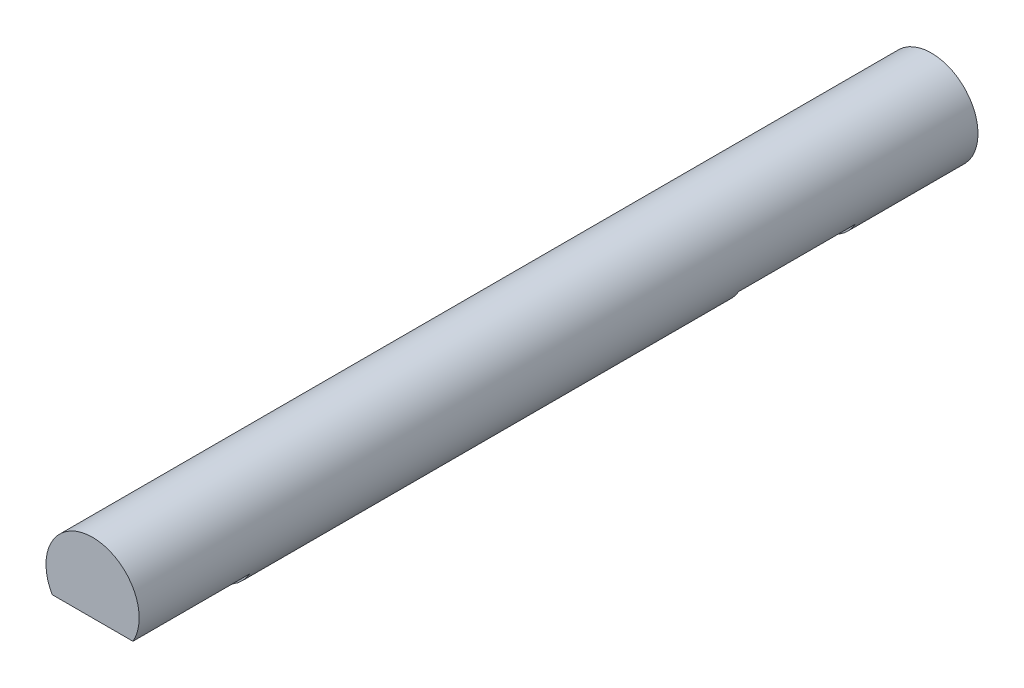
ISO-10303-21;
HEADER;
FILE_DESCRIPTION(('STEP AP214'),'2;1');
FILE_NAME('part.step','',(''),(''),'','','');
FILE_SCHEMA(('AUTOMOTIVE_DESIGN { 1 0 10303 214 1 1 1 1 }'));
ENDSEC;
DATA;
#1=APPLICATION_CONTEXT('core data for automotive mechanical design processes');
#2=APPLICATION_PROTOCOL_DEFINITION('international standard','automotive_design',2000,#1);
#3=PRODUCT_CONTEXT('',#1,'mechanical');
#4=PRODUCT('Part','Part','',(#3));
#5=PRODUCT_RELATED_PRODUCT_CATEGORY('part','',(#4));
#6=PRODUCT_DEFINITION_FORMATION('','',#4);
#7=PRODUCT_DEFINITION_CONTEXT('part definition',#1,'design');
#8=PRODUCT_DEFINITION('design','',#6,#7);
#9=PRODUCT_DEFINITION_SHAPE('','',#8);
#10=(LENGTH_UNIT() NAMED_UNIT(*) SI_UNIT(.MILLI.,.METRE.));
#11=(NAMED_UNIT(*) PLANE_ANGLE_UNIT() SI_UNIT($,.RADIAN.));
#12=(NAMED_UNIT(*) SI_UNIT($,.STERADIAN.) SOLID_ANGLE_UNIT());
#13=UNCERTAINTY_MEASURE_WITH_UNIT(LENGTH_MEASURE(1.E-05),#10,'distance_accuracy_value','');
#14=(GEOMETRIC_REPRESENTATION_CONTEXT(3) GLOBAL_UNCERTAINTY_ASSIGNED_CONTEXT((#13)) GLOBAL_UNIT_ASSIGNED_CONTEXT((#10,
#11,#12)) REPRESENTATION_CONTEXT('',''));
#15=CARTESIAN_POINT('',(0.,0.,0.));
#16=DIRECTION('',(0.,0.,1.));
#17=DIRECTION('',(1.,0.,0.));
#18=AXIS2_PLACEMENT_3D('',#15,#16,#17);
#19=CARTESIAN_POINT('',(0.,0.,36.));
#20=DIRECTION('',(0.,0.,-1.));
#21=DIRECTION('',(-1.,0.,0.));
#22=AXIS2_PLACEMENT_3D('',#19,#20,#21);
#23=CYLINDRICAL_SURFACE('',#22,2.);
#24=CARTESIAN_POINT('',(0.,0.,0.));
#25=DIRECTION('',(0.,0.,1.));
#26=DIRECTION('',(1.,0.,0.));
#27=AXIS2_PLACEMENT_3D('',#24,#25,#26);
#28=CIRCLE('',#27,2.);
#29=CARTESIAN_POINT('',(2.,0.,0.));
#30=VERTEX_POINT('',#29);
#31=EDGE_CURVE('E37',#30,#30,#28,.T.);
#32=ORIENTED_EDGE('',*,*,#31,.T.);
#33=EDGE_LOOP('',(#32));
#34=FACE_BOUND('',#33,.T.);
#35=CARTESIAN_POINT('',(0.,0.,36.));
#36=DIRECTION('',(0.,0.,1.));
#37=DIRECTION('',(1.,0.,0.));
#38=AXIS2_PLACEMENT_3D('',#35,#36,#37);
#39=CIRCLE('',#38,2.);
#40=CARTESIAN_POINT('',(1.73205080756888,-1.,36.));
#41=VERTEX_POINT('',#40);
#42=CARTESIAN_POINT('',(-1.73205080756888,-1.,36.));
#43=VERTEX_POINT('',#42);
#44=EDGE_CURVE('E11',#41,#43,#39,.T.);
#45=ORIENTED_EDGE('',*,*,#44,.F.);
#46=DIRECTION('',(0.,0.,1.));
#47=VECTOR('',#46,1.);
#48=CARTESIAN_POINT('',(1.73205080756888,-1.,31.));
#49=LINE('',#48,#47);
#50=CARTESIAN_POINT('',(1.73205080756888,-1.,31.));
#51=VERTEX_POINT('',#50);
#52=EDGE_CURVE('E55',#51,#41,#49,.T.);
#53=ORIENTED_EDGE('',*,*,#52,.F.);
#54=CARTESIAN_POINT('',(0.,0.,31.));
#55=DIRECTION('',(0.,0.,1.));
#56=DIRECTION('',(1.,0.,0.));
#57=AXIS2_PLACEMENT_3D('',#54,#55,#56);
#58=CIRCLE('',#57,2.);
#59=CARTESIAN_POINT('',(-1.73205080756888,-1.,31.));
#60=VERTEX_POINT('',#59);
#61=EDGE_CURVE('E95',#60,#51,#58,.T.);
#62=ORIENTED_EDGE('',*,*,#61,.F.);
#63=DIRECTION('',(0.,0.,1.));
#64=VECTOR('',#63,1.);
#65=CARTESIAN_POINT('',(-1.73205080756888,-1.,31.));
#66=LINE('',#65,#64);
#67=EDGE_CURVE('E101',#60,#43,#66,.T.);
#68=ORIENTED_EDGE('',*,*,#67,.T.);
#69=EDGE_LOOP('',(#45,#53,#62,#68));
#70=FACE_BOUND('',#69,.T.);
#71=CARTESIAN_POINT('',(0.,0.,10.));
#72=DIRECTION('',(0.,0.,-1.));
#73=DIRECTION('',(-1.,0.,0.));
#74=AXIS2_PLACEMENT_3D('',#71,#72,#73);
#75=CIRCLE('',#74,2.);
#76=CARTESIAN_POINT('',(1.73205080756888,-0.999999999999999,10.));
#77=VERTEX_POINT('',#76);
#78=CARTESIAN_POINT('',(-1.73205080756888,-1.,10.));
#79=VERTEX_POINT('',#78);
#80=EDGE_CURVE('E75',#77,#79,#75,.T.);
#81=ORIENTED_EDGE('',*,*,#80,.F.);
#82=DIRECTION('',(0.,0.,-1.));
#83=VECTOR('',#82,1.);
#84=CARTESIAN_POINT('',(1.73205080756888,-0.999999999999999,10.));
#85=LINE('',#84,#83);
#86=CARTESIAN_POINT('',(1.73205080756888,-0.999999999999999,5.));
#87=VERTEX_POINT('',#86);
#88=EDGE_CURVE('E87',#77,#87,#85,.T.);
#89=ORIENTED_EDGE('',*,*,#88,.T.);
#90=CARTESIAN_POINT('',(0.,0.,5.));
#91=DIRECTION('',(0.,0.,-1.));
#92=DIRECTION('',(-1.,0.,0.));
#93=AXIS2_PLACEMENT_3D('',#90,#91,#92);
#94=CIRCLE('',#93,2.);
#95=CARTESIAN_POINT('',(-1.73205080756888,-1.,5.));
#96=VERTEX_POINT('',#95);
#97=EDGE_CURVE('E89',#87,#96,#94,.T.);
#98=ORIENTED_EDGE('',*,*,#97,.T.);
#99=DIRECTION('',(0.,0.,-1.));
#100=VECTOR('',#99,1.);
#101=CARTESIAN_POINT('',(-1.73205080756888,-1.,10.));
#102=LINE('',#101,#100);
#103=EDGE_CURVE('E85',#79,#96,#102,.T.);
#104=ORIENTED_EDGE('',*,*,#103,.F.);
#105=EDGE_LOOP('',(#81,#89,#98,#104));
#106=FACE_BOUND('',#105,.T.);
#107=ADVANCED_FACE('F34',(#34,#70,#106),#23,.T.);
#108=CARTESIAN_POINT('',(0.,0.,36.));
#109=DIRECTION('',(0.,0.,1.));
#110=DIRECTION('',(1.,0.,0.));
#111=AXIS2_PLACEMENT_3D('',#108,#109,#110);
#112=PLANE('',#111);
#113=DIRECTION('',(-1.,0.,0.));
#114=VECTOR('',#113,1.);
#115=CARTESIAN_POINT('',(-1.73205080756888,-1.,36.));
#116=LINE('',#115,#114);
#117=EDGE_CURVE('E91',#41,#43,#116,.T.);
#118=ORIENTED_EDGE('',*,*,#117,.F.);
#119=ORIENTED_EDGE('',*,*,#44,.T.);
#120=EDGE_LOOP('',(#118,#119));
#121=FACE_BOUND('',#120,.T.);
#122=ADVANCED_FACE('F114',(#121),#112,.T.);
#123=CARTESIAN_POINT('',(0.,0.,0.));
#124=DIRECTION('',(0.,0.,1.));
#125=DIRECTION('',(1.,0.,0.));
#126=AXIS2_PLACEMENT_3D('',#123,#124,#125);
#127=PLANE('',#126);
#128=ORIENTED_EDGE('',*,*,#31,.F.);
#129=EDGE_LOOP('',(#128));
#130=FACE_BOUND('',#129,.T.);
#131=ADVANCED_FACE('F111',(#130),#127,.F.);
#132=CARTESIAN_POINT('',(-1.73205080756888,-1.,31.));
#133=DIRECTION('',(0.,1.,0.));
#134=DIRECTION('',(0.,0.,1.));
#135=AXIS2_PLACEMENT_3D('',#132,#133,#134);
#136=PLANE('',#135);
#137=ORIENTED_EDGE('',*,*,#117,.T.);
#138=ORIENTED_EDGE('',*,*,#67,.F.);
#139=DIRECTION('',(-1.,0.,0.));
#140=VECTOR('',#139,1.);
#141=CARTESIAN_POINT('',(-1.73205080756888,-1.,31.));
#142=LINE('',#141,#140);
#143=EDGE_CURVE('E97',#51,#60,#142,.T.);
#144=ORIENTED_EDGE('',*,*,#143,.F.);
#145=ORIENTED_EDGE('',*,*,#52,.T.);
#146=EDGE_LOOP('',(#137,#138,#144,#145));
#147=FACE_BOUND('',#146,.T.);
#148=ADVANCED_FACE('F113',(#147),#136,.F.);
#149=CARTESIAN_POINT('',(0.,0.,31.));
#150=DIRECTION('',(0.,0.,1.));
#151=DIRECTION('',(1.,0.,0.));
#152=AXIS2_PLACEMENT_3D('',#149,#150,#151);
#153=PLANE('',#152);
#154=ORIENTED_EDGE('',*,*,#61,.T.);
#155=ORIENTED_EDGE('',*,*,#143,.T.);
#156=EDGE_LOOP('',(#154,#155));
#157=FACE_BOUND('',#156,.T.);
#158=ADVANCED_FACE('F120',(#157),#153,.T.);
#159=CARTESIAN_POINT('',(-1.73205080756888,-1.,10.));
#160=DIRECTION('',(0.,1.,0.));
#161=DIRECTION('',(-1.,0.,0.));
#162=AXIS2_PLACEMENT_3D('',#159,#160,#161);
#163=PLANE('',#162);
#164=DIRECTION('',(1.,0.,0.));
#165=VECTOR('',#164,1.);
#166=CARTESIAN_POINT('',(-1.73205080756888,-1.,5.));
#167=LINE('',#166,#165);
#168=EDGE_CURVE('E47',#96,#87,#167,.T.);
#169=ORIENTED_EDGE('',*,*,#168,.T.);
#170=ORIENTED_EDGE('',*,*,#88,.F.);
#171=DIRECTION('',(1.,0.,0.));
#172=VECTOR('',#171,1.);
#173=CARTESIAN_POINT('',(-1.73205080756888,-1.,10.));
#174=LINE('',#173,#172);
#175=EDGE_CURVE('E78',#79,#77,#174,.T.);
#176=ORIENTED_EDGE('',*,*,#175,.F.);
#177=ORIENTED_EDGE('',*,*,#103,.T.);
#178=EDGE_LOOP('',(#169,#170,#176,#177));
#179=FACE_BOUND('',#178,.T.);
#180=ADVANCED_FACE('F84',(#179),#163,.F.);
#181=CARTESIAN_POINT('',(0.,0.,10.));
#182=DIRECTION('',(0.,0.,-1.));
#183=DIRECTION('',(-1.,0.,0.));
#184=AXIS2_PLACEMENT_3D('',#181,#182,#183);
#185=PLANE('',#184);
#186=ORIENTED_EDGE('',*,*,#80,.T.);
#187=ORIENTED_EDGE('',*,*,#175,.T.);
#188=EDGE_LOOP('',(#186,#187));
#189=FACE_BOUND('',#188,.T.);
#190=ADVANCED_FACE('F77',(#189),#185,.T.);
#191=CARTESIAN_POINT('',(0.,0.,5.));
#192=DIRECTION('',(0.,0.,-1.));
#193=DIRECTION('',(-1.,0.,0.));
#194=AXIS2_PLACEMENT_3D('',#191,#192,#193);
#195=PLANE('',#194);
#196=ORIENTED_EDGE('',*,*,#97,.F.);
#197=ORIENTED_EDGE('',*,*,#168,.F.);
#198=EDGE_LOOP('',(#196,#197));
#199=FACE_BOUND('',#198,.T.);
#200=ADVANCED_FACE('F148',(#199),#195,.F.);
#201=CLOSED_SHELL('',(#107,#122,#131,#148,#158,#180,#190,#200));
#202=MANIFOLD_SOLID_BREP('B2',#201);
#203=ADVANCED_BREP_SHAPE_REPRESENTATION('',(#18,#202),#14);
#204=SHAPE_DEFINITION_REPRESENTATION(#9,#203);
ENDSEC;
END-ISO-10303-21;
